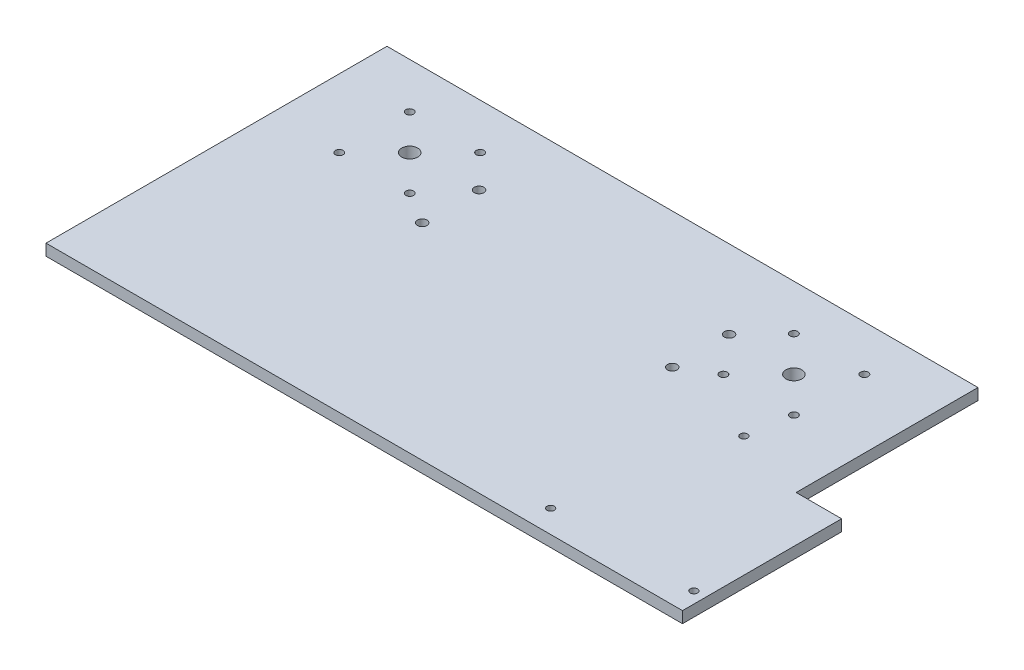
ISO-10303-21;
HEADER;
FILE_DESCRIPTION(('STEP AP214'),'2;1');
FILE_NAME('part.step','',(''),(''),'','','');
FILE_SCHEMA(('AUTOMOTIVE_DESIGN { 1 0 10303 214 1 1 1 1 }'));
ENDSEC;
DATA;
#1=APPLICATION_CONTEXT('core data for automotive mechanical design processes');
#2=APPLICATION_PROTOCOL_DEFINITION('international standard','automotive_design',2000,#1);
#3=PRODUCT_CONTEXT('',#1,'mechanical');
#4=PRODUCT('Part','Part','',(#3));
#5=PRODUCT_RELATED_PRODUCT_CATEGORY('part','',(#4));
#6=PRODUCT_DEFINITION_FORMATION('','',#4);
#7=PRODUCT_DEFINITION_CONTEXT('part definition',#1,'design');
#8=PRODUCT_DEFINITION('design','',#6,#7);
#9=PRODUCT_DEFINITION_SHAPE('','',#8);
#10=(LENGTH_UNIT() NAMED_UNIT(*) SI_UNIT(.MILLI.,.METRE.));
#11=(NAMED_UNIT(*) PLANE_ANGLE_UNIT() SI_UNIT($,.RADIAN.));
#12=(NAMED_UNIT(*) SI_UNIT($,.STERADIAN.) SOLID_ANGLE_UNIT());
#13=UNCERTAINTY_MEASURE_WITH_UNIT(LENGTH_MEASURE(1.E-05),#10,'distance_accuracy_value','');
#14=(GEOMETRIC_REPRESENTATION_CONTEXT(3) GLOBAL_UNCERTAINTY_ASSIGNED_CONTEXT((#13)) GLOBAL_UNIT_ASSIGNED_CONTEXT((#10,
#11,#12)) REPRESENTATION_CONTEXT('',''));
#15=CARTESIAN_POINT('',(0.,0.,0.));
#16=DIRECTION('',(0.,0.,1.));
#17=DIRECTION('',(1.,0.,0.));
#18=AXIS2_PLACEMENT_3D('',#15,#16,#17);
#19=CARTESIAN_POINT('',(120.,5.,0.));
#20=DIRECTION('',(1.,0.,0.));
#21=DIRECTION('',(0.,0.,-1.));
#22=AXIS2_PLACEMENT_3D('',#19,#20,#21);
#23=PLANE('',#22);
#24=DIRECTION('',(0.,0.,1.));
#25=VECTOR('',#24,1.);
#26=CARTESIAN_POINT('',(120.,0.,0.));
#27=LINE('',#26,#25);
#28=CARTESIAN_POINT('',(120.,0.,-75.));
#29=VERTEX_POINT('',#28);
#30=CARTESIAN_POINT('',(120.,0.,5.00000000000001));
#31=VERTEX_POINT('',#30);
#32=EDGE_CURVE('E130',#29,#31,#27,.T.);
#33=ORIENTED_EDGE('',*,*,#32,.F.);
#34=DIRECTION('',(0.,-1.,0.));
#35=VECTOR('',#34,1.);
#36=CARTESIAN_POINT('',(120.,5.,-75.));
#37=LINE('',#36,#35);
#38=CARTESIAN_POINT('',(120.,5.,-75.));
#39=VERTEX_POINT('',#38);
#40=EDGE_CURVE('E11',#39,#29,#37,.T.);
#41=ORIENTED_EDGE('',*,*,#40,.F.);
#42=DIRECTION('',(0.,0.,1.));
#43=VECTOR('',#42,1.);
#44=CARTESIAN_POINT('',(120.,5.,0.));
#45=LINE('',#44,#43);
#46=CARTESIAN_POINT('',(120.,5.,5.00000000000001));
#47=VERTEX_POINT('',#46);
#48=EDGE_CURVE('E478',#39,#47,#45,.T.);
#49=ORIENTED_EDGE('',*,*,#48,.T.);
#50=DIRECTION('',(0.,-1.,0.));
#51=VECTOR('',#50,1.);
#52=CARTESIAN_POINT('',(120.,5.,5.00000000000001));
#53=LINE('',#52,#51);
#54=EDGE_CURVE('E80',#47,#31,#53,.T.);
#55=ORIENTED_EDGE('',*,*,#54,.T.);
#56=EDGE_LOOP('',(#33,#41,#49,#55));
#57=FACE_BOUND('',#56,.T.);
#58=ADVANCED_FACE('F35',(#57),#23,.T.);
#59=CARTESIAN_POINT('',(0.,5.,-75.));
#60=DIRECTION('',(0.,0.,-1.));
#61=DIRECTION('',(-1.,0.,0.));
#62=AXIS2_PLACEMENT_3D('',#59,#60,#61);
#63=PLANE('',#62);
#64=DIRECTION('',(1.,0.,0.));
#65=VECTOR('',#64,1.);
#66=CARTESIAN_POINT('',(0.,0.,-75.));
#67=LINE('',#66,#65);
#68=CARTESIAN_POINT('',(-140.,0.,-75.));
#69=VERTEX_POINT('',#68);
#70=EDGE_CURVE('E128',#69,#29,#67,.T.);
#71=ORIENTED_EDGE('',*,*,#70,.F.);
#72=DIRECTION('',(0.,-1.,0.));
#73=VECTOR('',#72,1.);
#74=CARTESIAN_POINT('',(-140.,5.,-75.));
#75=LINE('',#74,#73);
#76=CARTESIAN_POINT('',(-140.,5.,-75.));
#77=VERTEX_POINT('',#76);
#78=EDGE_CURVE('E44',#77,#69,#75,.T.);
#79=ORIENTED_EDGE('',*,*,#78,.F.);
#80=DIRECTION('',(1.,0.,0.));
#81=VECTOR('',#80,1.);
#82=CARTESIAN_POINT('',(0.,5.,-75.));
#83=LINE('',#82,#81);
#84=EDGE_CURVE('E479',#77,#39,#83,.T.);
#85=ORIENTED_EDGE('',*,*,#84,.T.);
#86=ORIENTED_EDGE('',*,*,#40,.T.);
#87=EDGE_LOOP('',(#71,#79,#85,#86));
#88=FACE_BOUND('',#87,.T.);
#89=ADVANCED_FACE('F129',(#88),#63,.T.);
#90=CARTESIAN_POINT('',(-140.,5.,0.));
#91=DIRECTION('',(-1.,0.,0.));
#92=DIRECTION('',(0.,0.,1.));
#93=AXIS2_PLACEMENT_3D('',#90,#91,#92);
#94=PLANE('',#93);
#95=DIRECTION('',(0.,0.,-1.));
#96=VECTOR('',#95,1.);
#97=CARTESIAN_POINT('',(-140.,0.,0.));
#98=LINE('',#97,#96);
#99=CARTESIAN_POINT('',(-140.,0.,75.));
#100=VERTEX_POINT('',#99);
#101=EDGE_CURVE('E124',#100,#69,#98,.T.);
#102=ORIENTED_EDGE('',*,*,#101,.F.);
#103=DIRECTION('',(0.,-1.,0.));
#104=VECTOR('',#103,1.);
#105=CARTESIAN_POINT('',(-140.,5.,75.));
#106=LINE('',#105,#104);
#107=CARTESIAN_POINT('',(-140.,5.,75.));
#108=VERTEX_POINT('',#107);
#109=EDGE_CURVE('E114',#108,#100,#106,.T.);
#110=ORIENTED_EDGE('',*,*,#109,.F.);
#111=DIRECTION('',(0.,0.,-1.));
#112=VECTOR('',#111,1.);
#113=CARTESIAN_POINT('',(-140.,5.,0.));
#114=LINE('',#113,#112);
#115=EDGE_CURVE('E108',#108,#77,#114,.T.);
#116=ORIENTED_EDGE('',*,*,#115,.T.);
#117=ORIENTED_EDGE('',*,*,#78,.T.);
#118=EDGE_LOOP('',(#102,#110,#116,#117));
#119=FACE_BOUND('',#118,.T.);
#120=ADVANCED_FACE('F122',(#119),#94,.T.);
#121=CARTESIAN_POINT('',(0.,5.,75.));
#122=DIRECTION('',(0.,0.,-1.));
#123=DIRECTION('',(-1.,0.,0.));
#124=AXIS2_PLACEMENT_3D('',#121,#122,#123);
#125=PLANE('',#124);
#126=DIRECTION('',(1.,0.,0.));
#127=VECTOR('',#126,1.);
#128=CARTESIAN_POINT('',(0.,0.,75.));
#129=LINE('',#128,#127);
#130=CARTESIAN_POINT('',(140.,0.,75.));
#131=VERTEX_POINT('',#130);
#132=EDGE_CURVE('E113',#100,#131,#129,.T.);
#133=ORIENTED_EDGE('',*,*,#132,.T.);
#134=DIRECTION('',(0.,-1.,0.));
#135=VECTOR('',#134,1.);
#136=CARTESIAN_POINT('',(140.,5.,75.));
#137=LINE('',#136,#135);
#138=CARTESIAN_POINT('',(140.,5.,75.));
#139=VERTEX_POINT('',#138);
#140=EDGE_CURVE('E98',#139,#131,#137,.T.);
#141=ORIENTED_EDGE('',*,*,#140,.F.);
#142=DIRECTION('',(1.,0.,0.));
#143=VECTOR('',#142,1.);
#144=CARTESIAN_POINT('',(0.,5.,75.));
#145=LINE('',#144,#143);
#146=EDGE_CURVE('E101',#108,#139,#145,.T.);
#147=ORIENTED_EDGE('',*,*,#146,.F.);
#148=ORIENTED_EDGE('',*,*,#109,.T.);
#149=EDGE_LOOP('',(#133,#141,#147,#148));
#150=FACE_BOUND('',#149,.T.);
#151=ADVANCED_FACE('F111',(#150),#125,.F.);
#152=CARTESIAN_POINT('',(140.,5.,0.));
#153=DIRECTION('',(-1.,0.,0.));
#154=DIRECTION('',(0.,0.,1.));
#155=AXIS2_PLACEMENT_3D('',#152,#153,#154);
#156=PLANE('',#155);
#157=DIRECTION('',(0.,0.,-1.));
#158=VECTOR('',#157,1.);
#159=CARTESIAN_POINT('',(140.,0.,0.));
#160=LINE('',#159,#158);
#161=CARTESIAN_POINT('',(140.,0.,5.00000000000001));
#162=VERTEX_POINT('',#161);
#163=EDGE_CURVE('E134',#131,#162,#160,.T.);
#164=ORIENTED_EDGE('',*,*,#163,.T.);
#165=DIRECTION('',(0.,-1.,0.));
#166=VECTOR('',#165,1.);
#167=CARTESIAN_POINT('',(140.,5.,5.00000000000001));
#168=LINE('',#167,#166);
#169=CARTESIAN_POINT('',(140.,5.,5.00000000000001));
#170=VERTEX_POINT('',#169);
#171=EDGE_CURVE('E100',#170,#162,#168,.T.);
#172=ORIENTED_EDGE('',*,*,#171,.F.);
#173=DIRECTION('',(0.,0.,-1.));
#174=VECTOR('',#173,1.);
#175=CARTESIAN_POINT('',(140.,5.,0.));
#176=LINE('',#175,#174);
#177=EDGE_CURVE('E93',#139,#170,#176,.T.);
#178=ORIENTED_EDGE('',*,*,#177,.F.);
#179=ORIENTED_EDGE('',*,*,#140,.T.);
#180=EDGE_LOOP('',(#164,#172,#178,#179));
#181=FACE_BOUND('',#180,.T.);
#182=ADVANCED_FACE('F96',(#181),#156,.F.);
#183=CARTESIAN_POINT('',(59.,5.,-55.));
#184=DIRECTION('',(0.,-1.,0.));
#185=DIRECTION('',(0.,0.,-1.));
#186=AXIS2_PLACEMENT_3D('',#183,#184,#185);
#187=CYLINDRICAL_SURFACE('',#186,1.7);
#188=CARTESIAN_POINT('',(59.,5.,-55.));
#189=DIRECTION('',(0.,1.,0.));
#190=DIRECTION('',(0.,0.,1.));
#191=AXIS2_PLACEMENT_3D('',#188,#189,#190);
#192=CIRCLE('',#191,1.7);
#193=CARTESIAN_POINT('',(59.,5.,-53.3));
#194=VERTEX_POINT('',#193);
#195=EDGE_CURVE('E480',#194,#194,#192,.T.);
#196=ORIENTED_EDGE('',*,*,#195,.T.);
#197=EDGE_LOOP('',(#196));
#198=FACE_BOUND('',#197,.T.);
#199=CARTESIAN_POINT('',(59.,0.,-55.));
#200=DIRECTION('',(0.,1.,0.));
#201=DIRECTION('',(0.,0.,1.));
#202=AXIS2_PLACEMENT_3D('',#199,#200,#201);
#203=CIRCLE('',#202,1.7);
#204=CARTESIAN_POINT('',(59.,0.,-53.3));
#205=VERTEX_POINT('',#204);
#206=EDGE_CURVE('E190',#205,#205,#203,.T.);
#207=ORIENTED_EDGE('',*,*,#206,.F.);
#208=EDGE_LOOP('',(#207));
#209=FACE_BOUND('',#208,.T.);
#210=ADVANCED_FACE('F200',(#198,#209),#187,.F.);
#211=CARTESIAN_POINT('',(90.,5.,-55.));
#212=DIRECTION('',(0.,-1.,0.));
#213=DIRECTION('',(0.,0.,-1.));
#214=AXIS2_PLACEMENT_3D('',#211,#212,#213);
#215=CYLINDRICAL_SURFACE('',#214,1.7);
#216=CARTESIAN_POINT('',(90.,5.,-55.));
#217=DIRECTION('',(0.,1.,0.));
#218=DIRECTION('',(0.,0.,1.));
#219=AXIS2_PLACEMENT_3D('',#216,#217,#218);
#220=CIRCLE('',#219,1.7);
#221=CARTESIAN_POINT('',(90.,5.,-53.3));
#222=VERTEX_POINT('',#221);
#223=EDGE_CURVE('E484',#222,#222,#220,.T.);
#224=ORIENTED_EDGE('',*,*,#223,.T.);
#225=EDGE_LOOP('',(#224));
#226=FACE_BOUND('',#225,.T.);
#227=CARTESIAN_POINT('',(90.,0.,-55.));
#228=DIRECTION('',(0.,1.,0.));
#229=DIRECTION('',(0.,0.,1.));
#230=AXIS2_PLACEMENT_3D('',#227,#228,#229);
#231=CIRCLE('',#230,1.7);
#232=CARTESIAN_POINT('',(90.,0.,-53.3));
#233=VERTEX_POINT('',#232);
#234=EDGE_CURVE('E187',#233,#233,#231,.T.);
#235=ORIENTED_EDGE('',*,*,#234,.F.);
#236=EDGE_LOOP('',(#235));
#237=FACE_BOUND('',#236,.T.);
#238=ADVANCED_FACE('F203',(#226,#237),#215,.F.);
#239=CARTESIAN_POINT('',(59.,5.,-24.));
#240=DIRECTION('',(0.,-1.,0.));
#241=DIRECTION('',(0.,0.,-1.));
#242=AXIS2_PLACEMENT_3D('',#239,#240,#241);
#243=CYLINDRICAL_SURFACE('',#242,1.7);
#244=CARTESIAN_POINT('',(59.,5.,-24.));
#245=DIRECTION('',(0.,1.,0.));
#246=DIRECTION('',(0.,0.,1.));
#247=AXIS2_PLACEMENT_3D('',#244,#245,#246);
#248=CIRCLE('',#247,1.7);
#249=CARTESIAN_POINT('',(59.,5.,-22.3));
#250=VERTEX_POINT('',#249);
#251=EDGE_CURVE('E490',#250,#250,#248,.T.);
#252=ORIENTED_EDGE('',*,*,#251,.T.);
#253=EDGE_LOOP('',(#252));
#254=FACE_BOUND('',#253,.T.);
#255=CARTESIAN_POINT('',(59.,0.,-24.));
#256=DIRECTION('',(0.,1.,0.));
#257=DIRECTION('',(0.,0.,1.));
#258=AXIS2_PLACEMENT_3D('',#255,#256,#257);
#259=CIRCLE('',#258,1.7);
#260=CARTESIAN_POINT('',(59.,0.,-22.3));
#261=VERTEX_POINT('',#260);
#262=EDGE_CURVE('E184',#261,#261,#259,.T.);
#263=ORIENTED_EDGE('',*,*,#262,.F.);
#264=EDGE_LOOP('',(#263));
#265=FACE_BOUND('',#264,.T.);
#266=ADVANCED_FACE('F207',(#254,#265),#243,.F.);
#267=CARTESIAN_POINT('',(90.,5.,-24.));
#268=DIRECTION('',(0.,-1.,0.));
#269=DIRECTION('',(0.,0.,-1.));
#270=AXIS2_PLACEMENT_3D('',#267,#268,#269);
#271=CYLINDRICAL_SURFACE('',#270,1.7);
#272=CARTESIAN_POINT('',(90.,5.,-24.));
#273=DIRECTION('',(0.,1.,0.));
#274=DIRECTION('',(0.,0.,1.));
#275=AXIS2_PLACEMENT_3D('',#272,#273,#274);
#276=CIRCLE('',#275,1.7);
#277=CARTESIAN_POINT('',(90.,5.,-22.3));
#278=VERTEX_POINT('',#277);
#279=EDGE_CURVE('E493',#278,#278,#276,.T.);
#280=ORIENTED_EDGE('',*,*,#279,.T.);
#281=EDGE_LOOP('',(#280));
#282=FACE_BOUND('',#281,.T.);
#283=CARTESIAN_POINT('',(90.,0.,-24.));
#284=DIRECTION('',(0.,1.,0.));
#285=DIRECTION('',(0.,0.,1.));
#286=AXIS2_PLACEMENT_3D('',#283,#284,#285);
#287=CIRCLE('',#286,1.7);
#288=CARTESIAN_POINT('',(90.,0.,-22.3));
#289=VERTEX_POINT('',#288);
#290=EDGE_CURVE('E181',#289,#289,#287,.T.);
#291=ORIENTED_EDGE('',*,*,#290,.F.);
#292=EDGE_LOOP('',(#291));
#293=FACE_BOUND('',#292,.T.);
#294=ADVANCED_FACE('F211',(#282,#293),#271,.F.);
#295=CARTESIAN_POINT('',(-110.,5.,-55.));
#296=DIRECTION('',(0.,-1.,0.));
#297=DIRECTION('',(0.,0.,-1.));
#298=AXIS2_PLACEMENT_3D('',#295,#296,#297);
#299=CYLINDRICAL_SURFACE('',#298,1.70000000000001);
#300=CARTESIAN_POINT('',(-110.,5.,-55.));
#301=DIRECTION('',(0.,1.,0.));
#302=DIRECTION('',(0.,0.,1.));
#303=AXIS2_PLACEMENT_3D('',#300,#301,#302);
#304=CIRCLE('',#303,1.70000000000001);
#305=CARTESIAN_POINT('',(-110.,5.,-53.3));
#306=VERTEX_POINT('',#305);
#307=EDGE_CURVE('E496',#306,#306,#304,.T.);
#308=ORIENTED_EDGE('',*,*,#307,.T.);
#309=EDGE_LOOP('',(#308));
#310=FACE_BOUND('',#309,.T.);
#311=CARTESIAN_POINT('',(-110.,0.,-55.));
#312=DIRECTION('',(0.,1.,0.));
#313=DIRECTION('',(0.,0.,1.));
#314=AXIS2_PLACEMENT_3D('',#311,#312,#313);
#315=CIRCLE('',#314,1.70000000000001);
#316=CARTESIAN_POINT('',(-110.,0.,-53.3));
#317=VERTEX_POINT('',#316);
#318=EDGE_CURVE('E178',#317,#317,#315,.T.);
#319=ORIENTED_EDGE('',*,*,#318,.F.);
#320=EDGE_LOOP('',(#319));
#321=FACE_BOUND('',#320,.T.);
#322=ADVANCED_FACE('F215',(#310,#321),#299,.F.);
#323=CARTESIAN_POINT('',(-79.,5.,-55.));
#324=DIRECTION('',(0.,-1.,0.));
#325=DIRECTION('',(0.,0.,-1.));
#326=AXIS2_PLACEMENT_3D('',#323,#324,#325);
#327=CYLINDRICAL_SURFACE('',#326,1.70000000000001);
#328=CARTESIAN_POINT('',(-79.,5.,-55.));
#329=DIRECTION('',(0.,1.,0.));
#330=DIRECTION('',(0.,0.,1.));
#331=AXIS2_PLACEMENT_3D('',#328,#329,#330);
#332=CIRCLE('',#331,1.70000000000001);
#333=CARTESIAN_POINT('',(-79.,5.,-53.3));
#334=VERTEX_POINT('',#333);
#335=EDGE_CURVE('E499',#334,#334,#332,.T.);
#336=ORIENTED_EDGE('',*,*,#335,.T.);
#337=EDGE_LOOP('',(#336));
#338=FACE_BOUND('',#337,.T.);
#339=CARTESIAN_POINT('',(-79.,0.,-55.));
#340=DIRECTION('',(0.,1.,0.));
#341=DIRECTION('',(0.,0.,1.));
#342=AXIS2_PLACEMENT_3D('',#339,#340,#341);
#343=CIRCLE('',#342,1.70000000000001);
#344=CARTESIAN_POINT('',(-79.,0.,-53.3));
#345=VERTEX_POINT('',#344);
#346=EDGE_CURVE('E175',#345,#345,#343,.T.);
#347=ORIENTED_EDGE('',*,*,#346,.F.);
#348=EDGE_LOOP('',(#347));
#349=FACE_BOUND('',#348,.T.);
#350=ADVANCED_FACE('F219',(#338,#349),#327,.F.);
#351=CARTESIAN_POINT('',(-110.,5.,-24.));
#352=DIRECTION('',(0.,-1.,0.));
#353=DIRECTION('',(0.,0.,-1.));
#354=AXIS2_PLACEMENT_3D('',#351,#352,#353);
#355=CYLINDRICAL_SURFACE('',#354,1.7);
#356=CARTESIAN_POINT('',(-110.,5.,-24.));
#357=DIRECTION('',(0.,1.,0.));
#358=DIRECTION('',(0.,0.,1.));
#359=AXIS2_PLACEMENT_3D('',#356,#357,#358);
#360=CIRCLE('',#359,1.7);
#361=CARTESIAN_POINT('',(-110.,5.,-22.3));
#362=VERTEX_POINT('',#361);
#363=EDGE_CURVE('E502',#362,#362,#360,.T.);
#364=ORIENTED_EDGE('',*,*,#363,.T.);
#365=EDGE_LOOP('',(#364));
#366=FACE_BOUND('',#365,.T.);
#367=CARTESIAN_POINT('',(-110.,0.,-24.));
#368=DIRECTION('',(0.,1.,0.));
#369=DIRECTION('',(0.,0.,1.));
#370=AXIS2_PLACEMENT_3D('',#367,#368,#369);
#371=CIRCLE('',#370,1.7);
#372=CARTESIAN_POINT('',(-110.,0.,-22.3));
#373=VERTEX_POINT('',#372);
#374=EDGE_CURVE('E172',#373,#373,#371,.T.);
#375=ORIENTED_EDGE('',*,*,#374,.F.);
#376=EDGE_LOOP('',(#375));
#377=FACE_BOUND('',#376,.T.);
#378=ADVANCED_FACE('F223',(#366,#377),#355,.F.);
#379=CARTESIAN_POINT('',(-79.,5.,-24.));
#380=DIRECTION('',(0.,-1.,0.));
#381=DIRECTION('',(0.,0.,-1.));
#382=AXIS2_PLACEMENT_3D('',#379,#380,#381);
#383=CYLINDRICAL_SURFACE('',#382,1.7);
#384=CARTESIAN_POINT('',(-79.,5.,-24.));
#385=DIRECTION('',(0.,1.,0.));
#386=DIRECTION('',(0.,0.,1.));
#387=AXIS2_PLACEMENT_3D('',#384,#385,#386);
#388=CIRCLE('',#387,1.7);
#389=CARTESIAN_POINT('',(-79.,5.,-22.3));
#390=VERTEX_POINT('',#389);
#391=EDGE_CURVE('E505',#390,#390,#388,.T.);
#392=ORIENTED_EDGE('',*,*,#391,.T.);
#393=EDGE_LOOP('',(#392));
#394=FACE_BOUND('',#393,.T.);
#395=CARTESIAN_POINT('',(-79.,0.,-24.));
#396=DIRECTION('',(0.,1.,0.));
#397=DIRECTION('',(0.,0.,1.));
#398=AXIS2_PLACEMENT_3D('',#395,#396,#397);
#399=CIRCLE('',#398,1.7);
#400=CARTESIAN_POINT('',(-79.,0.,-22.3));
#401=VERTEX_POINT('',#400);
#402=EDGE_CURVE('E169',#401,#401,#399,.T.);
#403=ORIENTED_EDGE('',*,*,#402,.F.);
#404=EDGE_LOOP('',(#403));
#405=FACE_BOUND('',#404,.T.);
#406=ADVANCED_FACE('F227',(#394,#405),#383,.F.);
#407=CARTESIAN_POINT('',(-94.5,5.,-39.5));
#408=DIRECTION('',(0.,-1.,0.));
#409=DIRECTION('',(0.,0.,-1.));
#410=AXIS2_PLACEMENT_3D('',#407,#408,#409);
#411=CYLINDRICAL_SURFACE('',#410,3.50000000000001);
#412=CARTESIAN_POINT('',(-94.5,5.,-39.5));
#413=DIRECTION('',(0.,1.,0.));
#414=DIRECTION('',(0.,0.,1.));
#415=AXIS2_PLACEMENT_3D('',#412,#413,#414);
#416=CIRCLE('',#415,3.50000000000001);
#417=CARTESIAN_POINT('',(-94.5,5.,-36.));
#418=VERTEX_POINT('',#417);
#419=EDGE_CURVE('E508',#418,#418,#416,.T.);
#420=ORIENTED_EDGE('',*,*,#419,.T.);
#421=EDGE_LOOP('',(#420));
#422=FACE_BOUND('',#421,.T.);
#423=CARTESIAN_POINT('',(-94.5,0.,-39.5));
#424=DIRECTION('',(0.,1.,0.));
#425=DIRECTION('',(0.,0.,1.));
#426=AXIS2_PLACEMENT_3D('',#423,#424,#425);
#427=CIRCLE('',#426,3.50000000000001);
#428=CARTESIAN_POINT('',(-94.5,0.,-36.));
#429=VERTEX_POINT('',#428);
#430=EDGE_CURVE('E166',#429,#429,#427,.T.);
#431=ORIENTED_EDGE('',*,*,#430,.F.);
#432=EDGE_LOOP('',(#431));
#433=FACE_BOUND('',#432,.T.);
#434=ADVANCED_FACE('F231',(#422,#433),#411,.F.);
#435=CARTESIAN_POINT('',(74.5,5.,-39.5));
#436=DIRECTION('',(0.,-1.,0.));
#437=DIRECTION('',(0.,0.,-1.));
#438=AXIS2_PLACEMENT_3D('',#435,#436,#437);
#439=CYLINDRICAL_SURFACE('',#438,3.50000000000001);
#440=CARTESIAN_POINT('',(74.5,5.,-39.5));
#441=DIRECTION('',(0.,1.,0.));
#442=DIRECTION('',(0.,0.,1.));
#443=AXIS2_PLACEMENT_3D('',#440,#441,#442);
#444=CIRCLE('',#443,3.50000000000001);
#445=CARTESIAN_POINT('',(74.5,5.,-36.));
#446=VERTEX_POINT('',#445);
#447=EDGE_CURVE('E511',#446,#446,#444,.T.);
#448=ORIENTED_EDGE('',*,*,#447,.T.);
#449=EDGE_LOOP('',(#448));
#450=FACE_BOUND('',#449,.T.);
#451=CARTESIAN_POINT('',(74.5,0.,-39.5));
#452=DIRECTION('',(0.,1.,0.));
#453=DIRECTION('',(0.,0.,1.));
#454=AXIS2_PLACEMENT_3D('',#451,#452,#453);
#455=CIRCLE('',#454,3.50000000000001);
#456=CARTESIAN_POINT('',(74.5,0.,-36.));
#457=VERTEX_POINT('',#456);
#458=EDGE_CURVE('E163',#457,#457,#455,.T.);
#459=ORIENTED_EDGE('',*,*,#458,.F.);
#460=EDGE_LOOP('',(#459));
#461=FACE_BOUND('',#460,.T.);
#462=ADVANCED_FACE('F235',(#450,#461),#439,.F.);
#463=CARTESIAN_POINT('',(-65.,5.,-15.5));
#464=DIRECTION('',(0.,-1.,0.));
#465=DIRECTION('',(0.,0.,-1.));
#466=AXIS2_PLACEMENT_3D('',#463,#464,#465);
#467=CYLINDRICAL_SURFACE('',#466,2.1);
#468=CARTESIAN_POINT('',(-65.,5.,-15.5));
#469=DIRECTION('',(0.,1.,0.));
#470=DIRECTION('',(0.,0.,1.));
#471=AXIS2_PLACEMENT_3D('',#468,#469,#470);
#472=CIRCLE('',#471,2.1);
#473=CARTESIAN_POINT('',(-65.,5.,-13.4));
#474=VERTEX_POINT('',#473);
#475=EDGE_CURVE('E514',#474,#474,#472,.T.);
#476=ORIENTED_EDGE('',*,*,#475,.T.);
#477=EDGE_LOOP('',(#476));
#478=FACE_BOUND('',#477,.T.);
#479=CARTESIAN_POINT('',(-65.,0.,-15.5));
#480=DIRECTION('',(0.,1.,0.));
#481=DIRECTION('',(0.,0.,1.));
#482=AXIS2_PLACEMENT_3D('',#479,#480,#481);
#483=CIRCLE('',#482,2.1);
#484=CARTESIAN_POINT('',(-65.,0.,-13.4));
#485=VERTEX_POINT('',#484);
#486=EDGE_CURVE('E160',#485,#485,#483,.T.);
#487=ORIENTED_EDGE('',*,*,#486,.F.);
#488=EDGE_LOOP('',(#487));
#489=FACE_BOUND('',#488,.T.);
#490=ADVANCED_FACE('F239',(#478,#489),#467,.F.);
#491=CARTESIAN_POINT('',(-65.,5.,-40.5));
#492=DIRECTION('',(0.,-1.,0.));
#493=DIRECTION('',(0.,0.,-1.));
#494=AXIS2_PLACEMENT_3D('',#491,#492,#493);
#495=CYLINDRICAL_SURFACE('',#494,2.1);
#496=CARTESIAN_POINT('',(-65.,5.,-40.5));
#497=DIRECTION('',(0.,1.,0.));
#498=DIRECTION('',(0.,0.,1.));
#499=AXIS2_PLACEMENT_3D('',#496,#497,#498);
#500=CIRCLE('',#499,2.1);
#501=CARTESIAN_POINT('',(-65.,5.,-38.4));
#502=VERTEX_POINT('',#501);
#503=EDGE_CURVE('E517',#502,#502,#500,.T.);
#504=ORIENTED_EDGE('',*,*,#503,.T.);
#505=EDGE_LOOP('',(#504));
#506=FACE_BOUND('',#505,.T.);
#507=CARTESIAN_POINT('',(-65.,0.,-40.5));
#508=DIRECTION('',(0.,1.,0.));
#509=DIRECTION('',(0.,0.,1.));
#510=AXIS2_PLACEMENT_3D('',#507,#508,#509);
#511=CIRCLE('',#510,2.1);
#512=CARTESIAN_POINT('',(-65.,0.,-38.4));
#513=VERTEX_POINT('',#512);
#514=EDGE_CURVE('E157',#513,#513,#511,.T.);
#515=ORIENTED_EDGE('',*,*,#514,.F.);
#516=EDGE_LOOP('',(#515));
#517=FACE_BOUND('',#516,.T.);
#518=ADVANCED_FACE('F243',(#506,#517),#495,.F.);
#519=CARTESIAN_POINT('',(45.,5.,-15.5));
#520=DIRECTION('',(0.,-1.,0.));
#521=DIRECTION('',(0.,0.,-1.));
#522=AXIS2_PLACEMENT_3D('',#519,#520,#521);
#523=CYLINDRICAL_SURFACE('',#522,2.1);
#524=CARTESIAN_POINT('',(45.,5.,-15.5));
#525=DIRECTION('',(0.,1.,0.));
#526=DIRECTION('',(0.,0.,1.));
#527=AXIS2_PLACEMENT_3D('',#524,#525,#526);
#528=CIRCLE('',#527,2.1);
#529=CARTESIAN_POINT('',(45.,5.,-13.4));
#530=VERTEX_POINT('',#529);
#531=EDGE_CURVE('E520',#530,#530,#528,.T.);
#532=ORIENTED_EDGE('',*,*,#531,.T.);
#533=EDGE_LOOP('',(#532));
#534=FACE_BOUND('',#533,.T.);
#535=CARTESIAN_POINT('',(45.,0.,-15.5));
#536=DIRECTION('',(0.,1.,0.));
#537=DIRECTION('',(0.,0.,1.));
#538=AXIS2_PLACEMENT_3D('',#535,#536,#537);
#539=CIRCLE('',#538,2.1);
#540=CARTESIAN_POINT('',(45.,0.,-13.4));
#541=VERTEX_POINT('',#540);
#542=EDGE_CURVE('E154',#541,#541,#539,.T.);
#543=ORIENTED_EDGE('',*,*,#542,.F.);
#544=EDGE_LOOP('',(#543));
#545=FACE_BOUND('',#544,.T.);
#546=ADVANCED_FACE('F247',(#534,#545),#523,.F.);
#547=CARTESIAN_POINT('',(45.,5.,-40.5));
#548=DIRECTION('',(0.,-1.,0.));
#549=DIRECTION('',(0.,0.,-1.));
#550=AXIS2_PLACEMENT_3D('',#547,#548,#549);
#551=CYLINDRICAL_SURFACE('',#550,2.1);
#552=CARTESIAN_POINT('',(45.,5.,-40.5));
#553=DIRECTION('',(0.,1.,0.));
#554=DIRECTION('',(0.,0.,1.));
#555=AXIS2_PLACEMENT_3D('',#552,#553,#554);
#556=CIRCLE('',#555,2.1);
#557=CARTESIAN_POINT('',(45.,5.,-38.4));
#558=VERTEX_POINT('',#557);
#559=EDGE_CURVE('E523',#558,#558,#556,.T.);
#560=ORIENTED_EDGE('',*,*,#559,.T.);
#561=EDGE_LOOP('',(#560));
#562=FACE_BOUND('',#561,.T.);
#563=CARTESIAN_POINT('',(45.,0.,-40.5));
#564=DIRECTION('',(0.,1.,0.));
#565=DIRECTION('',(0.,0.,1.));
#566=AXIS2_PLACEMENT_3D('',#563,#564,#565);
#567=CIRCLE('',#566,2.1);
#568=CARTESIAN_POINT('',(45.,0.,-38.4));
#569=VERTEX_POINT('',#568);
#570=EDGE_CURVE('E151',#569,#569,#567,.T.);
#571=ORIENTED_EDGE('',*,*,#570,.F.);
#572=EDGE_LOOP('',(#571));
#573=FACE_BOUND('',#572,.T.);
#574=ADVANCED_FACE('F251',(#562,#573),#551,.F.);
#575=CARTESIAN_POINT('',(135.,5.,65.));
#576=DIRECTION('',(0.,-1.,0.));
#577=DIRECTION('',(0.,0.,-1.));
#578=AXIS2_PLACEMENT_3D('',#575,#576,#577);
#579=CYLINDRICAL_SURFACE('',#578,1.59999999999999);
#580=CARTESIAN_POINT('',(135.,5.,65.));
#581=DIRECTION('',(0.,1.,0.));
#582=DIRECTION('',(0.,0.,1.));
#583=AXIS2_PLACEMENT_3D('',#580,#581,#582);
#584=CIRCLE('',#583,1.59999999999999);
#585=CARTESIAN_POINT('',(135.,5.,66.6));
#586=VERTEX_POINT('',#585);
#587=EDGE_CURVE('E526',#586,#586,#584,.T.);
#588=ORIENTED_EDGE('',*,*,#587,.T.);
#589=EDGE_LOOP('',(#588));
#590=FACE_BOUND('',#589,.T.);
#591=CARTESIAN_POINT('',(135.,0.,65.));
#592=DIRECTION('',(0.,1.,0.));
#593=DIRECTION('',(0.,0.,1.));
#594=AXIS2_PLACEMENT_3D('',#591,#592,#593);
#595=CIRCLE('',#594,1.59999999999999);
#596=CARTESIAN_POINT('',(135.,0.,66.6));
#597=VERTEX_POINT('',#596);
#598=EDGE_CURVE('E148',#597,#597,#595,.T.);
#599=ORIENTED_EDGE('',*,*,#598,.F.);
#600=EDGE_LOOP('',(#599));
#601=FACE_BOUND('',#600,.T.);
#602=ADVANCED_FACE('F255',(#590,#601),#579,.F.);
#603=CARTESIAN_POINT('',(87.0000000000001,5.,-4.99999999999998));
#604=DIRECTION('',(0.,-1.,0.));
#605=DIRECTION('',(0.,0.,-1.));
#606=AXIS2_PLACEMENT_3D('',#603,#604,#605);
#607=CYLINDRICAL_SURFACE('',#606,1.60000000000001);
#608=CARTESIAN_POINT('',(87.0000000000001,5.,-4.99999999999998));
#609=DIRECTION('',(0.,1.,0.));
#610=DIRECTION('',(0.,0.,1.));
#611=AXIS2_PLACEMENT_3D('',#608,#609,#610);
#612=CIRCLE('',#611,1.60000000000001);
#613=CARTESIAN_POINT('',(87.0000000000001,5.,-3.39999999999998));
#614=VERTEX_POINT('',#613);
#615=EDGE_CURVE('E270',#614,#614,#612,.T.);
#616=ORIENTED_EDGE('',*,*,#615,.T.);
#617=EDGE_LOOP('',(#616));
#618=FACE_BOUND('',#617,.T.);
#619=CARTESIAN_POINT('',(87.0000000000001,0.,-4.99999999999998));
#620=DIRECTION('',(0.,1.,0.));
#621=DIRECTION('',(0.,0.,1.));
#622=AXIS2_PLACEMENT_3D('',#619,#620,#621);
#623=CIRCLE('',#622,1.60000000000001);
#624=CARTESIAN_POINT('',(87.0000000000001,0.,-3.39999999999998));
#625=VERTEX_POINT('',#624);
#626=EDGE_CURVE('E145',#625,#625,#623,.T.);
#627=ORIENTED_EDGE('',*,*,#626,.F.);
#628=EDGE_LOOP('',(#627));
#629=FACE_BOUND('',#628,.T.);
#630=ADVANCED_FACE('F258',(#618,#629),#607,.F.);
#631=CARTESIAN_POINT('',(72.0000000000001,5.,65.));
#632=DIRECTION('',(0.,-1.,0.));
#633=DIRECTION('',(0.,0.,-1.));
#634=AXIS2_PLACEMENT_3D('',#631,#632,#633);
#635=CYLINDRICAL_SURFACE('',#634,1.60000000000001);
#636=CARTESIAN_POINT('',(72.0000000000001,5.,65.));
#637=DIRECTION('',(0.,1.,0.));
#638=DIRECTION('',(0.,0.,1.));
#639=AXIS2_PLACEMENT_3D('',#636,#637,#638);
#640=CIRCLE('',#639,1.60000000000001);
#641=CARTESIAN_POINT('',(72.0000000000001,5.,66.6));
#642=VERTEX_POINT('',#641);
#643=EDGE_CURVE('E139',#642,#642,#640,.T.);
#644=ORIENTED_EDGE('',*,*,#643,.T.);
#645=EDGE_LOOP('',(#644));
#646=FACE_BOUND('',#645,.T.);
#647=CARTESIAN_POINT('',(72.0000000000001,0.,65.));
#648=DIRECTION('',(0.,1.,0.));
#649=DIRECTION('',(0.,0.,1.));
#650=AXIS2_PLACEMENT_3D('',#647,#648,#649);
#651=CIRCLE('',#650,1.60000000000001);
#652=CARTESIAN_POINT('',(72.0000000000001,0.,66.6));
#653=VERTEX_POINT('',#652);
#654=EDGE_CURVE('E142',#653,#653,#651,.T.);
#655=ORIENTED_EDGE('',*,*,#654,.F.);
#656=EDGE_LOOP('',(#655));
#657=FACE_BOUND('',#656,.T.);
#658=ADVANCED_FACE('F37',(#646,#657),#635,.F.);
#659=CARTESIAN_POINT('',(0.,5.,5.00000000000001));
#660=DIRECTION('',(0.,0.,1.));
#661=DIRECTION('',(1.,0.,0.));
#662=AXIS2_PLACEMENT_3D('',#659,#660,#661);
#663=PLANE('',#662);
#664=DIRECTION('',(-1.,0.,0.));
#665=VECTOR('',#664,1.);
#666=CARTESIAN_POINT('',(0.,0.,5.00000000000001));
#667=LINE('',#666,#665);
#668=EDGE_CURVE('E73',#162,#31,#667,.T.);
#669=ORIENTED_EDGE('',*,*,#668,.T.);
#670=ORIENTED_EDGE('',*,*,#54,.F.);
#671=DIRECTION('',(-1.,0.,0.));
#672=VECTOR('',#671,1.);
#673=CARTESIAN_POINT('',(0.,5.,5.00000000000001));
#674=LINE('',#673,#672);
#675=EDGE_CURVE('E52',#170,#47,#674,.T.);
#676=ORIENTED_EDGE('',*,*,#675,.F.);
#677=ORIENTED_EDGE('',*,*,#171,.T.);
#678=EDGE_LOOP('',(#669,#670,#676,#677));
#679=FACE_BOUND('',#678,.T.);
#680=ADVANCED_FACE('F265',(#679),#663,.F.);
#681=CARTESIAN_POINT('',(0.,5.,0.));
#682=DIRECTION('',(0.,1.,0.));
#683=DIRECTION('',(0.,0.,1.));
#684=AXIS2_PLACEMENT_3D('',#681,#682,#683);
#685=PLANE('',#684);
#686=ORIENTED_EDGE('',*,*,#643,.F.);
#687=EDGE_LOOP('',(#686));
#688=FACE_BOUND('',#687,.T.);
#689=ORIENTED_EDGE('',*,*,#615,.F.);
#690=EDGE_LOOP('',(#689));
#691=FACE_BOUND('',#690,.T.);
#692=ORIENTED_EDGE('',*,*,#587,.F.);
#693=EDGE_LOOP('',(#692));
#694=FACE_BOUND('',#693,.T.);
#695=ORIENTED_EDGE('',*,*,#559,.F.);
#696=EDGE_LOOP('',(#695));
#697=FACE_BOUND('',#696,.T.);
#698=ORIENTED_EDGE('',*,*,#531,.F.);
#699=EDGE_LOOP('',(#698));
#700=FACE_BOUND('',#699,.T.);
#701=ORIENTED_EDGE('',*,*,#503,.F.);
#702=EDGE_LOOP('',(#701));
#703=FACE_BOUND('',#702,.T.);
#704=ORIENTED_EDGE('',*,*,#475,.F.);
#705=EDGE_LOOP('',(#704));
#706=FACE_BOUND('',#705,.T.);
#707=ORIENTED_EDGE('',*,*,#447,.F.);
#708=EDGE_LOOP('',(#707));
#709=FACE_BOUND('',#708,.T.);
#710=ORIENTED_EDGE('',*,*,#419,.F.);
#711=EDGE_LOOP('',(#710));
#712=FACE_BOUND('',#711,.T.);
#713=ORIENTED_EDGE('',*,*,#391,.F.);
#714=EDGE_LOOP('',(#713));
#715=FACE_BOUND('',#714,.T.);
#716=ORIENTED_EDGE('',*,*,#363,.F.);
#717=EDGE_LOOP('',(#716));
#718=FACE_BOUND('',#717,.T.);
#719=ORIENTED_EDGE('',*,*,#335,.F.);
#720=EDGE_LOOP('',(#719));
#721=FACE_BOUND('',#720,.T.);
#722=ORIENTED_EDGE('',*,*,#307,.F.);
#723=EDGE_LOOP('',(#722));
#724=FACE_BOUND('',#723,.T.);
#725=ORIENTED_EDGE('',*,*,#279,.F.);
#726=EDGE_LOOP('',(#725));
#727=FACE_BOUND('',#726,.T.);
#728=ORIENTED_EDGE('',*,*,#251,.F.);
#729=EDGE_LOOP('',(#728));
#730=FACE_BOUND('',#729,.T.);
#731=ORIENTED_EDGE('',*,*,#223,.F.);
#732=EDGE_LOOP('',(#731));
#733=FACE_BOUND('',#732,.T.);
#734=ORIENTED_EDGE('',*,*,#195,.F.);
#735=EDGE_LOOP('',(#734));
#736=FACE_BOUND('',#735,.T.);
#737=ORIENTED_EDGE('',*,*,#48,.F.);
#738=ORIENTED_EDGE('',*,*,#84,.F.);
#739=ORIENTED_EDGE('',*,*,#115,.F.);
#740=ORIENTED_EDGE('',*,*,#146,.T.);
#741=ORIENTED_EDGE('',*,*,#177,.T.);
#742=ORIENTED_EDGE('',*,*,#675,.T.);
#743=EDGE_LOOP('',(#737,#738,#739,#740,#741,#742));
#744=FACE_BOUND('',#743,.T.);
#745=ADVANCED_FACE('F105',(#688,#691,#694,#697,#700,#703,#706,#709,#712,#715,#718,#721,#724,
#727,#730,#733,#736,#744),#685,.T.);
#746=CARTESIAN_POINT('',(0.,0.,0.));
#747=DIRECTION('',(0.,1.,0.));
#748=DIRECTION('',(0.,0.,1.));
#749=AXIS2_PLACEMENT_3D('',#746,#747,#748);
#750=PLANE('',#749);
#751=ORIENTED_EDGE('',*,*,#654,.T.);
#752=EDGE_LOOP('',(#751));
#753=FACE_BOUND('',#752,.T.);
#754=ORIENTED_EDGE('',*,*,#626,.T.);
#755=EDGE_LOOP('',(#754));
#756=FACE_BOUND('',#755,.T.);
#757=ORIENTED_EDGE('',*,*,#598,.T.);
#758=EDGE_LOOP('',(#757));
#759=FACE_BOUND('',#758,.T.);
#760=ORIENTED_EDGE('',*,*,#570,.T.);
#761=EDGE_LOOP('',(#760));
#762=FACE_BOUND('',#761,.T.);
#763=ORIENTED_EDGE('',*,*,#542,.T.);
#764=EDGE_LOOP('',(#763));
#765=FACE_BOUND('',#764,.T.);
#766=ORIENTED_EDGE('',*,*,#514,.T.);
#767=EDGE_LOOP('',(#766));
#768=FACE_BOUND('',#767,.T.);
#769=ORIENTED_EDGE('',*,*,#486,.T.);
#770=EDGE_LOOP('',(#769));
#771=FACE_BOUND('',#770,.T.);
#772=ORIENTED_EDGE('',*,*,#458,.T.);
#773=EDGE_LOOP('',(#772));
#774=FACE_BOUND('',#773,.T.);
#775=ORIENTED_EDGE('',*,*,#430,.T.);
#776=EDGE_LOOP('',(#775));
#777=FACE_BOUND('',#776,.T.);
#778=ORIENTED_EDGE('',*,*,#402,.T.);
#779=EDGE_LOOP('',(#778));
#780=FACE_BOUND('',#779,.T.);
#781=ORIENTED_EDGE('',*,*,#374,.T.);
#782=EDGE_LOOP('',(#781));
#783=FACE_BOUND('',#782,.T.);
#784=ORIENTED_EDGE('',*,*,#346,.T.);
#785=EDGE_LOOP('',(#784));
#786=FACE_BOUND('',#785,.T.);
#787=ORIENTED_EDGE('',*,*,#318,.T.);
#788=EDGE_LOOP('',(#787));
#789=FACE_BOUND('',#788,.T.);
#790=ORIENTED_EDGE('',*,*,#290,.T.);
#791=EDGE_LOOP('',(#790));
#792=FACE_BOUND('',#791,.T.);
#793=ORIENTED_EDGE('',*,*,#262,.T.);
#794=EDGE_LOOP('',(#793));
#795=FACE_BOUND('',#794,.T.);
#796=ORIENTED_EDGE('',*,*,#234,.T.);
#797=EDGE_LOOP('',(#796));
#798=FACE_BOUND('',#797,.T.);
#799=ORIENTED_EDGE('',*,*,#206,.T.);
#800=EDGE_LOOP('',(#799));
#801=FACE_BOUND('',#800,.T.);
#802=ORIENTED_EDGE('',*,*,#32,.T.);
#803=ORIENTED_EDGE('',*,*,#668,.F.);
#804=ORIENTED_EDGE('',*,*,#163,.F.);
#805=ORIENTED_EDGE('',*,*,#132,.F.);
#806=ORIENTED_EDGE('',*,*,#101,.T.);
#807=ORIENTED_EDGE('',*,*,#70,.T.);
#808=EDGE_LOOP('',(#802,#803,#804,#805,#806,#807));
#809=FACE_BOUND('',#808,.T.);
#810=ADVANCED_FACE('F132',(#753,#756,#759,#762,#765,#768,#771,#774,#777,#780,#783,#786,#789,
#792,#795,#798,#801,#809),#750,.F.);
#811=CLOSED_SHELL('',(#58,#89,#120,#151,#182,#210,#238,#266,#294,#322,#350,#378,#406,#434,#462,
#490,#518,#546,#574,#602,#630,#658,#680,#745,#810));
#812=MANIFOLD_SOLID_BREP('B2',#811);
#813=ADVANCED_BREP_SHAPE_REPRESENTATION('',(#18,#812),#14);
#814=SHAPE_DEFINITION_REPRESENTATION(#9,#813);
ENDSEC;
END-ISO-10303-21;
